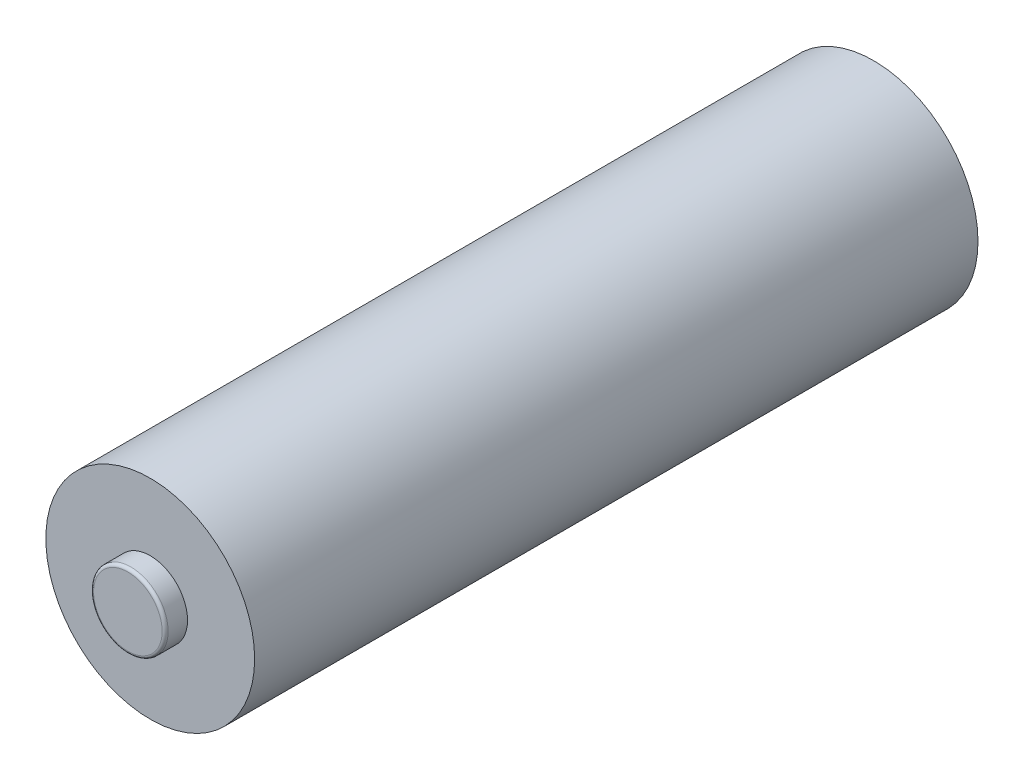
ISO-10303-21;
HEADER;
FILE_DESCRIPTION(('STEP AP214'),'2;1');
FILE_NAME('part.step','',(''),(''),'','','');
FILE_SCHEMA(('AUTOMOTIVE_DESIGN { 1 0 10303 214 1 1 1 1 }'));
ENDSEC;
DATA;
#1=APPLICATION_CONTEXT('core data for automotive mechanical design processes');
#2=APPLICATION_PROTOCOL_DEFINITION('international standard','automotive_design',2000,#1);
#3=PRODUCT_CONTEXT('',#1,'mechanical');
#4=PRODUCT('Part','Part','',(#3));
#5=PRODUCT_RELATED_PRODUCT_CATEGORY('part','',(#4));
#6=PRODUCT_DEFINITION_FORMATION('','',#4);
#7=PRODUCT_DEFINITION_CONTEXT('part definition',#1,'design');
#8=PRODUCT_DEFINITION('design','',#6,#7);
#9=PRODUCT_DEFINITION_SHAPE('','',#8);
#10=(LENGTH_UNIT() NAMED_UNIT(*) SI_UNIT(.MILLI.,.METRE.));
#11=(NAMED_UNIT(*) PLANE_ANGLE_UNIT() SI_UNIT($,.RADIAN.));
#12=(NAMED_UNIT(*) SI_UNIT($,.STERADIAN.) SOLID_ANGLE_UNIT());
#13=UNCERTAINTY_MEASURE_WITH_UNIT(LENGTH_MEASURE(1.E-05),#10,'distance_accuracy_value','');
#14=(GEOMETRIC_REPRESENTATION_CONTEXT(3) GLOBAL_UNCERTAINTY_ASSIGNED_CONTEXT((#13)) GLOBAL_UNIT_ASSIGNED_CONTEXT((#10,
#11,#12)) REPRESENTATION_CONTEXT('',''));
#15=CARTESIAN_POINT('',(0.,0.,0.));
#16=DIRECTION('',(0.,0.,1.));
#17=DIRECTION('',(1.,0.,0.));
#18=AXIS2_PLACEMENT_3D('',#15,#16,#17);
#19=CARTESIAN_POINT('',(0.,0.,49.8));
#20=DIRECTION('',(0.,0.,1.));
#21=DIRECTION('',(1.,0.,0.));
#22=AXIS2_PLACEMENT_3D('',#19,#20,#21);
#23=TOROIDAL_SURFACE('',#22,2.3,0.2);
#24=CARTESIAN_POINT('',(0.,0.,50.));
#25=DIRECTION('',(0.,0.,1.));
#26=DIRECTION('',(1.,0.,0.));
#27=AXIS2_PLACEMENT_3D('',#24,#25,#26);
#28=CIRCLE('',#27,2.3);
#29=CARTESIAN_POINT('',(2.3,0.,50.));
#30=VERTEX_POINT('',#29);
#31=EDGE_CURVE('E52',#30,#30,#28,.T.);
#32=ORIENTED_EDGE('',*,*,#31,.F.);
#33=EDGE_LOOP('',(#32));
#34=FACE_BOUND('',#33,.T.);
#35=CARTESIAN_POINT('',(0.,0.,49.8));
#36=DIRECTION('',(0.,0.,1.));
#37=DIRECTION('',(1.,0.,0.));
#38=AXIS2_PLACEMENT_3D('',#35,#36,#37);
#39=CIRCLE('',#38,2.5);
#40=CARTESIAN_POINT('',(2.5,0.,49.8));
#41=VERTEX_POINT('',#40);
#42=EDGE_CURVE('E12',#41,#41,#39,.F.);
#43=ORIENTED_EDGE('',*,*,#42,.F.);
#44=EDGE_LOOP('',(#43));
#45=FACE_BOUND('',#44,.T.);
#46=ADVANCED_FACE('F46',(#34,#45),#23,.T.);
#47=CARTESIAN_POINT('',(0.,0.,50.));
#48=DIRECTION('',(0.,0.,-1.));
#49=DIRECTION('',(-1.,0.,0.));
#50=AXIS2_PLACEMENT_3D('',#47,#48,#49);
#51=CYLINDRICAL_SURFACE('',#50,7.);
#52=CARTESIAN_POINT('',(0.,0.,0.));
#53=DIRECTION('',(0.,0.,1.));
#54=DIRECTION('',(1.,0.,0.));
#55=AXIS2_PLACEMENT_3D('',#52,#53,#54);
#56=CIRCLE('',#55,7.);
#57=CARTESIAN_POINT('',(7.,0.,0.));
#58=VERTEX_POINT('',#57);
#59=EDGE_CURVE('E56',#58,#58,#56,.T.);
#60=ORIENTED_EDGE('',*,*,#59,.T.);
#61=EDGE_LOOP('',(#60));
#62=FACE_BOUND('',#61,.T.);
#63=CARTESIAN_POINT('',(0.,0.,48.5));
#64=DIRECTION('',(0.,0.,1.));
#65=DIRECTION('',(1.,0.,0.));
#66=AXIS2_PLACEMENT_3D('',#63,#64,#65);
#67=CIRCLE('',#66,7.);
#68=CARTESIAN_POINT('',(7.,0.,48.5));
#69=VERTEX_POINT('',#68);
#70=EDGE_CURVE('E60',#69,#69,#67,.T.);
#71=ORIENTED_EDGE('',*,*,#70,.F.);
#72=EDGE_LOOP('',(#71));
#73=FACE_BOUND('',#72,.T.);
#74=ADVANCED_FACE('F78',(#62,#73),#51,.T.);
#75=CARTESIAN_POINT('',(0.,0.,0.));
#76=DIRECTION('',(0.,0.,1.));
#77=DIRECTION('',(1.,0.,0.));
#78=AXIS2_PLACEMENT_3D('',#75,#76,#77);
#79=PLANE('',#78);
#80=ORIENTED_EDGE('',*,*,#59,.F.);
#81=EDGE_LOOP('',(#80));
#82=FACE_BOUND('',#81,.T.);
#83=ADVANCED_FACE('F74',(#82),#79,.F.);
#84=CARTESIAN_POINT('',(0.,0.,48.5));
#85=DIRECTION('',(0.,0.,1.));
#86=DIRECTION('',(1.,0.,0.));
#87=AXIS2_PLACEMENT_3D('',#84,#85,#86);
#88=PLANE('',#87);
#89=CARTESIAN_POINT('',(0.,0.,48.5));
#90=DIRECTION('',(0.,0.,1.));
#91=DIRECTION('',(1.,0.,0.));
#92=AXIS2_PLACEMENT_3D('',#89,#90,#91);
#93=CIRCLE('',#92,2.5);
#94=CARTESIAN_POINT('',(2.5,0.,48.5));
#95=VERTEX_POINT('',#94);
#96=EDGE_CURVE('E65',#95,#95,#93,.T.);
#97=ORIENTED_EDGE('',*,*,#96,.F.);
#98=EDGE_LOOP('',(#97));
#99=FACE_BOUND('',#98,.T.);
#100=ORIENTED_EDGE('',*,*,#70,.T.);
#101=EDGE_LOOP('',(#100));
#102=FACE_BOUND('',#101,.T.);
#103=ADVANCED_FACE('F71',(#99,#102),#88,.T.);
#104=CARTESIAN_POINT('',(0.,0.,48.5));
#105=DIRECTION('',(0.,0.,1.));
#106=DIRECTION('',(1.,0.,0.));
#107=AXIS2_PLACEMENT_3D('',#104,#105,#106);
#108=CYLINDRICAL_SURFACE('',#107,2.5);
#109=ORIENTED_EDGE('',*,*,#42,.T.);
#110=EDGE_LOOP('',(#109));
#111=FACE_BOUND('',#110,.T.);
#112=ORIENTED_EDGE('',*,*,#96,.T.);
#113=EDGE_LOOP('',(#112));
#114=FACE_BOUND('',#113,.T.);
#115=ADVANCED_FACE('F69',(#111,#114),#108,.T.);
#116=CARTESIAN_POINT('',(0.,0.,50.));
#117=DIRECTION('',(0.,0.,1.));
#118=DIRECTION('',(1.,0.,0.));
#119=AXIS2_PLACEMENT_3D('',#116,#117,#118);
#120=PLANE('',#119);
#121=ORIENTED_EDGE('',*,*,#31,.T.);
#122=EDGE_LOOP('',(#121));
#123=FACE_BOUND('',#122,.T.);
#124=ADVANCED_FACE('F89',(#123),#120,.T.);
#125=CLOSED_SHELL('',(#46,#74,#83,#103,#115,#124));
#126=MANIFOLD_SOLID_BREP('B2',#125);
#127=ADVANCED_BREP_SHAPE_REPRESENTATION('',(#18,#126),#14);
#128=SHAPE_DEFINITION_REPRESENTATION(#9,#127);
ENDSEC;
END-ISO-10303-21;
